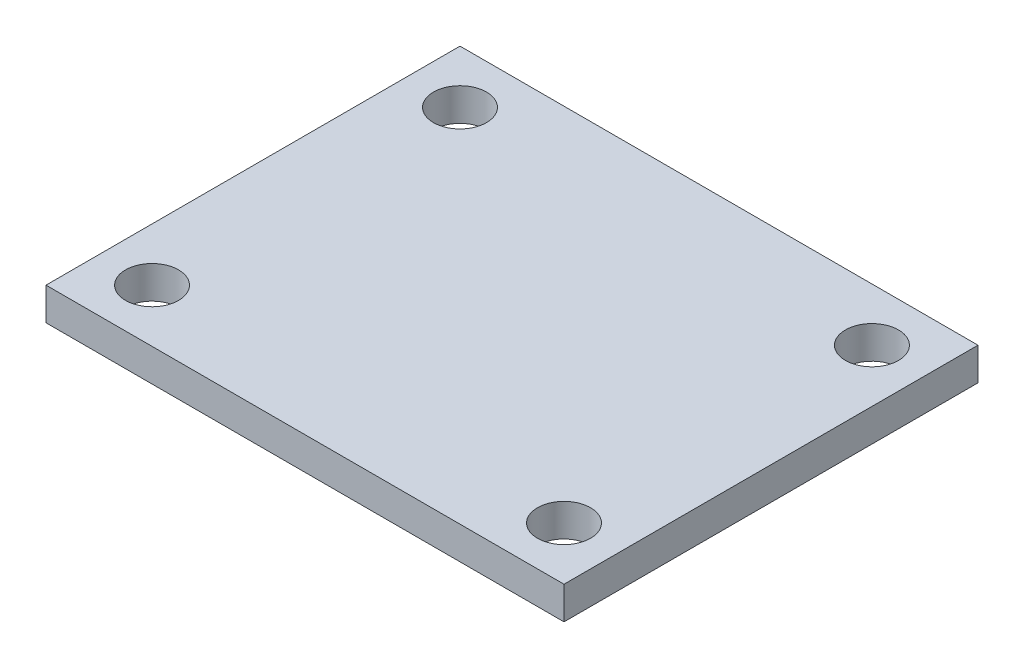
ISO-10303-21;
HEADER;
FILE_DESCRIPTION(('STEP AP214'),'2;1');
FILE_NAME('part.step','',(''),(''),'','','');
FILE_SCHEMA(('AUTOMOTIVE_DESIGN { 1 0 10303 214 1 1 1 1 }'));
ENDSEC;
DATA;
#1=APPLICATION_CONTEXT('core data for automotive mechanical design processes');
#2=APPLICATION_PROTOCOL_DEFINITION('international standard','automotive_design',2000,#1);
#3=PRODUCT_CONTEXT('',#1,'mechanical');
#4=PRODUCT('Part','Part','',(#3));
#5=PRODUCT_RELATED_PRODUCT_CATEGORY('part','',(#4));
#6=PRODUCT_DEFINITION_FORMATION('','',#4);
#7=PRODUCT_DEFINITION_CONTEXT('part definition',#1,'design');
#8=PRODUCT_DEFINITION('design','',#6,#7);
#9=PRODUCT_DEFINITION_SHAPE('','',#8);
#10=(LENGTH_UNIT() NAMED_UNIT(*) SI_UNIT(.MILLI.,.METRE.));
#11=(NAMED_UNIT(*) PLANE_ANGLE_UNIT() SI_UNIT($,.RADIAN.));
#12=(NAMED_UNIT(*) SI_UNIT($,.STERADIAN.) SOLID_ANGLE_UNIT());
#13=UNCERTAINTY_MEASURE_WITH_UNIT(LENGTH_MEASURE(1.E-05),#10,'distance_accuracy_value','');
#14=(GEOMETRIC_REPRESENTATION_CONTEXT(3) GLOBAL_UNCERTAINTY_ASSIGNED_CONTEXT((#13)) GLOBAL_UNIT_ASSIGNED_CONTEXT((#10,
#11,#12)) REPRESENTATION_CONTEXT('',''));
#15=CARTESIAN_POINT('',(0.,0.,0.));
#16=DIRECTION('',(0.,0.,1.));
#17=DIRECTION('',(1.,0.,0.));
#18=AXIS2_PLACEMENT_3D('',#15,#16,#17);
#19=CARTESIAN_POINT('',(12.7,1.6,-10.15));
#20=DIRECTION('',(-1.,0.,0.));
#21=DIRECTION('',(0.,0.,1.));
#22=AXIS2_PLACEMENT_3D('',#19,#20,#21);
#23=PLANE('',#22);
#24=DIRECTION('',(0.,0.,-1.));
#25=VECTOR('',#24,1.);
#26=CARTESIAN_POINT('',(12.7,0.,-10.15));
#27=LINE('',#26,#25);
#28=CARTESIAN_POINT('',(12.7,0.,10.15));
#29=VERTEX_POINT('',#28);
#30=CARTESIAN_POINT('',(12.7,0.,-10.15));
#31=VERTEX_POINT('',#30);
#32=EDGE_CURVE('E96',#29,#31,#27,.T.);
#33=ORIENTED_EDGE('',*,*,#32,.T.);
#34=DIRECTION('',(0.,-1.,0.));
#35=VECTOR('',#34,1.);
#36=CARTESIAN_POINT('',(12.7,1.6,-10.15));
#37=LINE('',#36,#35);
#38=CARTESIAN_POINT('',(12.7,1.6,-10.15));
#39=VERTEX_POINT('',#38);
#40=EDGE_CURVE('E11',#39,#31,#37,.T.);
#41=ORIENTED_EDGE('',*,*,#40,.F.);
#42=DIRECTION('',(0.,0.,-1.));
#43=VECTOR('',#42,1.);
#44=CARTESIAN_POINT('',(12.7,1.6,-10.15));
#45=LINE('',#44,#43);
#46=CARTESIAN_POINT('',(12.7,1.6,10.15));
#47=VERTEX_POINT('',#46);
#48=EDGE_CURVE('E84',#47,#39,#45,.T.);
#49=ORIENTED_EDGE('',*,*,#48,.F.);
#50=DIRECTION('',(0.,-1.,0.));
#51=VECTOR('',#50,1.);
#52=CARTESIAN_POINT('',(12.7,1.6,10.15));
#53=LINE('',#52,#51);
#54=EDGE_CURVE('E92',#47,#29,#53,.T.);
#55=ORIENTED_EDGE('',*,*,#54,.T.);
#56=EDGE_LOOP('',(#33,#41,#49,#55));
#57=FACE_BOUND('',#56,.T.);
#58=ADVANCED_FACE('F33',(#57),#23,.F.);
#59=CARTESIAN_POINT('',(-12.7,1.6,-10.15));
#60=DIRECTION('',(0.,0.,1.));
#61=DIRECTION('',(1.,0.,0.));
#62=AXIS2_PLACEMENT_3D('',#59,#60,#61);
#63=PLANE('',#62);
#64=DIRECTION('',(-1.,0.,0.));
#65=VECTOR('',#64,1.);
#66=CARTESIAN_POINT('',(-12.7,0.,-10.15));
#67=LINE('',#66,#65);
#68=CARTESIAN_POINT('',(-12.7,0.,-10.15));
#69=VERTEX_POINT('',#68);
#70=EDGE_CURVE('E88',#31,#69,#67,.T.);
#71=ORIENTED_EDGE('',*,*,#70,.T.);
#72=DIRECTION('',(0.,-1.,0.));
#73=VECTOR('',#72,1.);
#74=CARTESIAN_POINT('',(-12.7,1.6,-10.15));
#75=LINE('',#74,#73);
#76=CARTESIAN_POINT('',(-12.7,1.6,-10.15));
#77=VERTEX_POINT('',#76);
#78=EDGE_CURVE('E41',#77,#69,#75,.T.);
#79=ORIENTED_EDGE('',*,*,#78,.F.);
#80=DIRECTION('',(-1.,0.,0.));
#81=VECTOR('',#80,1.);
#82=CARTESIAN_POINT('',(-12.7,1.6,-10.15));
#83=LINE('',#82,#81);
#84=EDGE_CURVE('E79',#39,#77,#83,.T.);
#85=ORIENTED_EDGE('',*,*,#84,.F.);
#86=ORIENTED_EDGE('',*,*,#40,.T.);
#87=EDGE_LOOP('',(#71,#79,#85,#86));
#88=FACE_BOUND('',#87,.T.);
#89=ADVANCED_FACE('F87',(#88),#63,.F.);
#90=CARTESIAN_POINT('',(-12.7,1.6,-10.15));
#91=DIRECTION('',(1.,0.,0.));
#92=DIRECTION('',(0.,0.,-1.));
#93=AXIS2_PLACEMENT_3D('',#90,#91,#92);
#94=PLANE('',#93);
#95=DIRECTION('',(0.,0.,1.));
#96=VECTOR('',#95,1.);
#97=CARTESIAN_POINT('',(-12.7,0.,-10.15));
#98=LINE('',#97,#96);
#99=CARTESIAN_POINT('',(-12.7,0.,10.15));
#100=VERTEX_POINT('',#99);
#101=EDGE_CURVE('E66',#69,#100,#98,.T.);
#102=ORIENTED_EDGE('',*,*,#101,.T.);
#103=DIRECTION('',(0.,-1.,0.));
#104=VECTOR('',#103,1.);
#105=CARTESIAN_POINT('',(-12.7,1.6,10.15));
#106=LINE('',#105,#104);
#107=CARTESIAN_POINT('',(-12.7,1.6,10.15));
#108=VERTEX_POINT('',#107);
#109=EDGE_CURVE('E89',#108,#100,#106,.T.);
#110=ORIENTED_EDGE('',*,*,#109,.F.);
#111=DIRECTION('',(0.,0.,1.));
#112=VECTOR('',#111,1.);
#113=CARTESIAN_POINT('',(-12.7,1.6,-10.15));
#114=LINE('',#113,#112);
#115=EDGE_CURVE('E82',#77,#108,#114,.T.);
#116=ORIENTED_EDGE('',*,*,#115,.F.);
#117=ORIENTED_EDGE('',*,*,#78,.T.);
#118=EDGE_LOOP('',(#102,#110,#116,#117));
#119=FACE_BOUND('',#118,.T.);
#120=ADVANCED_FACE('F90',(#119),#94,.F.);
#121=CARTESIAN_POINT('',(-12.7,1.6,10.15));
#122=DIRECTION('',(0.,0.,-1.));
#123=DIRECTION('',(-1.,0.,0.));
#124=AXIS2_PLACEMENT_3D('',#121,#122,#123);
#125=PLANE('',#124);
#126=DIRECTION('',(1.,0.,0.));
#127=VECTOR('',#126,1.);
#128=CARTESIAN_POINT('',(-12.7,0.,10.15));
#129=LINE('',#128,#127);
#130=EDGE_CURVE('E72',#100,#29,#129,.T.);
#131=ORIENTED_EDGE('',*,*,#130,.T.);
#132=ORIENTED_EDGE('',*,*,#54,.F.);
#133=DIRECTION('',(1.,0.,0.));
#134=VECTOR('',#133,1.);
#135=CARTESIAN_POINT('',(-12.7,1.6,10.15));
#136=LINE('',#135,#134);
#137=EDGE_CURVE('E49',#108,#47,#136,.T.);
#138=ORIENTED_EDGE('',*,*,#137,.F.);
#139=ORIENTED_EDGE('',*,*,#109,.T.);
#140=EDGE_LOOP('',(#131,#132,#138,#139));
#141=FACE_BOUND('',#140,.T.);
#142=ADVANCED_FACE('F104',(#141),#125,.F.);
#143=CARTESIAN_POINT('',(0.,1.6,0.));
#144=DIRECTION('',(0.,1.,0.));
#145=DIRECTION('',(0.,0.,1.));
#146=AXIS2_PLACEMENT_3D('',#143,#144,#145);
#147=PLANE('',#146);
#148=CARTESIAN_POINT('',(-10.1,1.6,7.55));
#149=DIRECTION('',(0.,1.,0.));
#150=DIRECTION('',(0.,0.,-1.));
#151=AXIS2_PLACEMENT_3D('',#148,#149,#150);
#152=CIRCLE('',#151,1.3);
#153=CARTESIAN_POINT('',(-10.1,1.6,6.25));
#154=VERTEX_POINT('',#153);
#155=EDGE_CURVE('E128',#154,#154,#152,.T.);
#156=ORIENTED_EDGE('',*,*,#155,.F.);
#157=EDGE_LOOP('',(#156));
#158=FACE_BOUND('',#157,.T.);
#159=CARTESIAN_POINT('',(10.1,1.6,7.55));
#160=DIRECTION('',(0.,1.,0.));
#161=DIRECTION('',(0.,0.,1.));
#162=AXIS2_PLACEMENT_3D('',#159,#160,#161);
#163=CIRCLE('',#162,1.3);
#164=CARTESIAN_POINT('',(10.1,1.6,8.85));
#165=VERTEX_POINT('',#164);
#166=EDGE_CURVE('E122',#165,#165,#163,.T.);
#167=ORIENTED_EDGE('',*,*,#166,.F.);
#168=EDGE_LOOP('',(#167));
#169=FACE_BOUND('',#168,.T.);
#170=CARTESIAN_POINT('',(10.1,1.6,-7.55));
#171=DIRECTION('',(0.,1.,0.));
#172=DIRECTION('',(0.,0.,-1.));
#173=AXIS2_PLACEMENT_3D('',#170,#171,#172);
#174=CIRCLE('',#173,1.3);
#175=CARTESIAN_POINT('',(10.1,1.6,-8.85));
#176=VERTEX_POINT('',#175);
#177=EDGE_CURVE('E116',#176,#176,#174,.T.);
#178=ORIENTED_EDGE('',*,*,#177,.F.);
#179=EDGE_LOOP('',(#178));
#180=FACE_BOUND('',#179,.T.);
#181=CARTESIAN_POINT('',(-10.1,1.6,-7.55));
#182=DIRECTION('',(0.,1.,0.));
#183=DIRECTION('',(0.,0.,1.));
#184=AXIS2_PLACEMENT_3D('',#181,#182,#183);
#185=CIRCLE('',#184,1.3);
#186=CARTESIAN_POINT('',(-10.1,1.6,-6.25));
#187=VERTEX_POINT('',#186);
#188=EDGE_CURVE('E110',#187,#187,#185,.T.);
#189=ORIENTED_EDGE('',*,*,#188,.F.);
#190=EDGE_LOOP('',(#189));
#191=FACE_BOUND('',#190,.T.);
#192=ORIENTED_EDGE('',*,*,#48,.T.);
#193=ORIENTED_EDGE('',*,*,#84,.T.);
#194=ORIENTED_EDGE('',*,*,#115,.T.);
#195=ORIENTED_EDGE('',*,*,#137,.T.);
#196=EDGE_LOOP('',(#192,#193,#194,#195));
#197=FACE_BOUND('',#196,.T.);
#198=ADVANCED_FACE('F80',(#158,#169,#180,#191,#197),#147,.T.);
#199=CARTESIAN_POINT('',(0.,0.,0.));
#200=DIRECTION('',(0.,1.,0.));
#201=DIRECTION('',(0.,0.,1.));
#202=AXIS2_PLACEMENT_3D('',#199,#200,#201);
#203=PLANE('',#202);
#204=CARTESIAN_POINT('',(-10.1,0.,7.55));
#205=DIRECTION('',(0.,1.,0.));
#206=DIRECTION('',(0.,0.,-1.));
#207=AXIS2_PLACEMENT_3D('',#204,#205,#206);
#208=CIRCLE('',#207,1.3);
#209=CARTESIAN_POINT('',(-10.1,0.,6.25));
#210=VERTEX_POINT('',#209);
#211=EDGE_CURVE('E125',#210,#210,#208,.T.);
#212=ORIENTED_EDGE('',*,*,#211,.T.);
#213=EDGE_LOOP('',(#212));
#214=FACE_BOUND('',#213,.T.);
#215=CARTESIAN_POINT('',(10.1,0.,7.55));
#216=DIRECTION('',(0.,1.,0.));
#217=DIRECTION('',(0.,0.,1.));
#218=AXIS2_PLACEMENT_3D('',#215,#216,#217);
#219=CIRCLE('',#218,1.3);
#220=CARTESIAN_POINT('',(10.1,0.,8.85));
#221=VERTEX_POINT('',#220);
#222=EDGE_CURVE('E119',#221,#221,#219,.T.);
#223=ORIENTED_EDGE('',*,*,#222,.T.);
#224=EDGE_LOOP('',(#223));
#225=FACE_BOUND('',#224,.T.);
#226=CARTESIAN_POINT('',(10.1,0.,-7.55));
#227=DIRECTION('',(0.,1.,0.));
#228=DIRECTION('',(0.,0.,-1.));
#229=AXIS2_PLACEMENT_3D('',#226,#227,#228);
#230=CIRCLE('',#229,1.3);
#231=CARTESIAN_POINT('',(10.1,0.,-8.85));
#232=VERTEX_POINT('',#231);
#233=EDGE_CURVE('E113',#232,#232,#230,.T.);
#234=ORIENTED_EDGE('',*,*,#233,.T.);
#235=EDGE_LOOP('',(#234));
#236=FACE_BOUND('',#235,.T.);
#237=CARTESIAN_POINT('',(-10.1,0.,-7.55));
#238=DIRECTION('',(0.,1.,0.));
#239=DIRECTION('',(0.,0.,1.));
#240=AXIS2_PLACEMENT_3D('',#237,#238,#239);
#241=CIRCLE('',#240,1.3);
#242=CARTESIAN_POINT('',(-10.1,0.,-6.25));
#243=VERTEX_POINT('',#242);
#244=EDGE_CURVE('E99',#243,#243,#241,.T.);
#245=ORIENTED_EDGE('',*,*,#244,.T.);
#246=EDGE_LOOP('',(#245));
#247=FACE_BOUND('',#246,.T.);
#248=ORIENTED_EDGE('',*,*,#32,.F.);
#249=ORIENTED_EDGE('',*,*,#130,.F.);
#250=ORIENTED_EDGE('',*,*,#101,.F.);
#251=ORIENTED_EDGE('',*,*,#70,.F.);
#252=EDGE_LOOP('',(#248,#249,#250,#251));
#253=FACE_BOUND('',#252,.T.);
#254=ADVANCED_FACE('F107',(#214,#225,#236,#247,#253),#203,.F.);
#255=CARTESIAN_POINT('',(-10.1,0.,-7.55));
#256=DIRECTION('',(0.,1.,0.));
#257=DIRECTION('',(0.,0.,1.));
#258=AXIS2_PLACEMENT_3D('',#255,#256,#257);
#259=CYLINDRICAL_SURFACE('',#258,1.3);
#260=ORIENTED_EDGE('',*,*,#244,.F.);
#261=EDGE_LOOP('',(#260));
#262=FACE_BOUND('',#261,.T.);
#263=ORIENTED_EDGE('',*,*,#188,.T.);
#264=EDGE_LOOP('',(#263));
#265=FACE_BOUND('',#264,.T.);
#266=ADVANCED_FACE('F152',(#262,#265),#259,.F.);
#267=CARTESIAN_POINT('',(10.1,0.,-7.55));
#268=DIRECTION('',(0.,1.,0.));
#269=DIRECTION('',(0.,0.,1.));
#270=AXIS2_PLACEMENT_3D('',#267,#268,#269);
#271=CYLINDRICAL_SURFACE('',#270,1.3);
#272=ORIENTED_EDGE('',*,*,#233,.F.);
#273=EDGE_LOOP('',(#272));
#274=FACE_BOUND('',#273,.T.);
#275=ORIENTED_EDGE('',*,*,#177,.T.);
#276=EDGE_LOOP('',(#275));
#277=FACE_BOUND('',#276,.T.);
#278=ADVANCED_FACE('F154',(#274,#277),#271,.F.);
#279=CARTESIAN_POINT('',(10.1,0.,7.55));
#280=DIRECTION('',(0.,1.,0.));
#281=DIRECTION('',(0.,0.,1.));
#282=AXIS2_PLACEMENT_3D('',#279,#280,#281);
#283=CYLINDRICAL_SURFACE('',#282,1.3);
#284=ORIENTED_EDGE('',*,*,#222,.F.);
#285=EDGE_LOOP('',(#284));
#286=FACE_BOUND('',#285,.T.);
#287=ORIENTED_EDGE('',*,*,#166,.T.);
#288=EDGE_LOOP('',(#287));
#289=FACE_BOUND('',#288,.T.);
#290=ADVANCED_FACE('F139',(#286,#289),#283,.F.);
#291=CARTESIAN_POINT('',(-10.1,0.,7.55));
#292=DIRECTION('',(0.,1.,0.));
#293=DIRECTION('',(0.,0.,1.));
#294=AXIS2_PLACEMENT_3D('',#291,#292,#293);
#295=CYLINDRICAL_SURFACE('',#294,1.3);
#296=ORIENTED_EDGE('',*,*,#211,.F.);
#297=EDGE_LOOP('',(#296));
#298=FACE_BOUND('',#297,.T.);
#299=ORIENTED_EDGE('',*,*,#155,.T.);
#300=EDGE_LOOP('',(#299));
#301=FACE_BOUND('',#300,.T.);
#302=ADVANCED_FACE('F136',(#298,#301),#295,.F.);
#303=CLOSED_SHELL('',(#58,#89,#120,#142,#198,#254,#266,#278,#290,#302));
#304=MANIFOLD_SOLID_BREP('B2',#303);
#305=ADVANCED_BREP_SHAPE_REPRESENTATION('',(#18,#304),#14);
#306=SHAPE_DEFINITION_REPRESENTATION(#9,#305);
ENDSEC;
END-ISO-10303-21;
